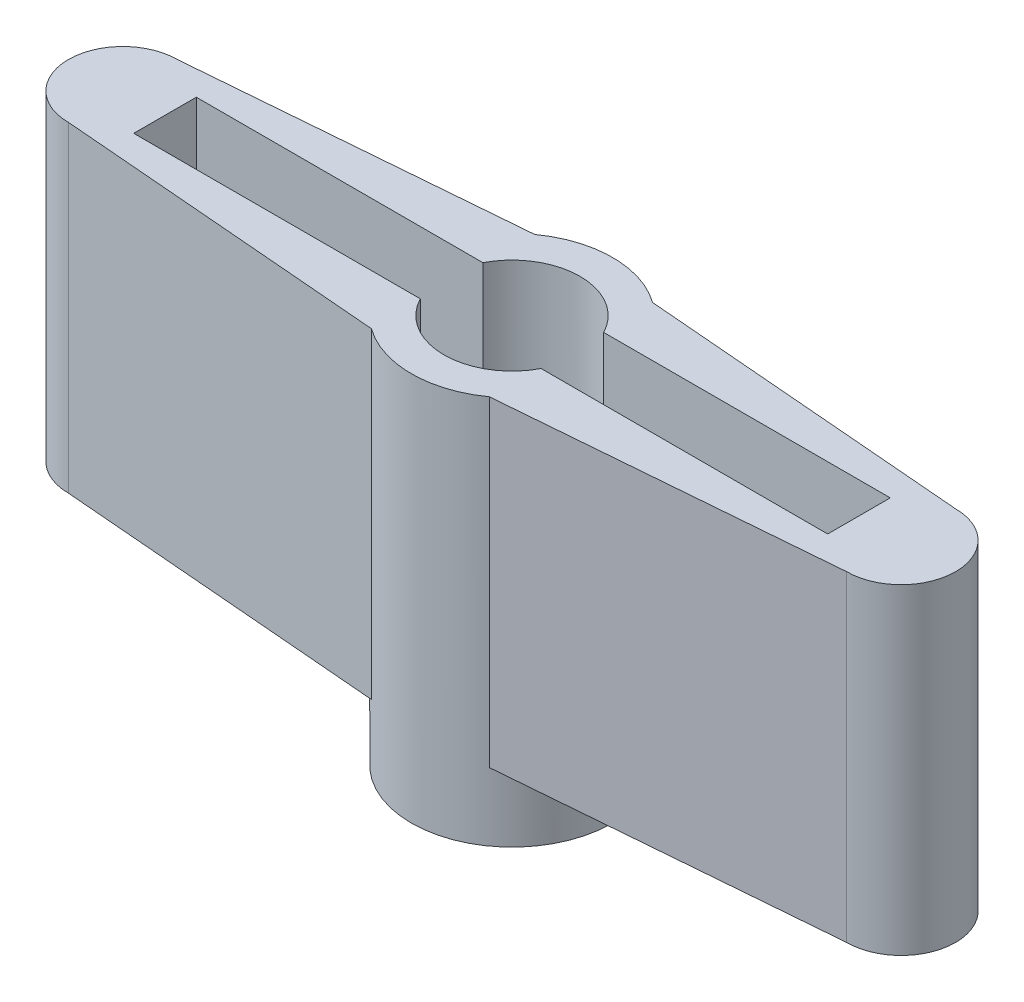
ISO-10303-21;
HEADER;
FILE_DESCRIPTION(('STEP AP214'),'2;1');
FILE_NAME('part.step','',(''),(''),'','','');
FILE_SCHEMA(('AUTOMOTIVE_DESIGN { 1 0 10303 214 1 1 1 1 }'));
ENDSEC;
DATA;
#1=APPLICATION_CONTEXT('core data for automotive mechanical design processes');
#2=APPLICATION_PROTOCOL_DEFINITION('international standard','automotive_design',2000,#1);
#3=PRODUCT_CONTEXT('',#1,'mechanical');
#4=PRODUCT('Part','Part','',(#3));
#5=PRODUCT_RELATED_PRODUCT_CATEGORY('part','',(#4));
#6=PRODUCT_DEFINITION_FORMATION('','',#4);
#7=PRODUCT_DEFINITION_CONTEXT('part definition',#1,'design');
#8=PRODUCT_DEFINITION('design','',#6,#7);
#9=PRODUCT_DEFINITION_SHAPE('','',#8);
#10=(LENGTH_UNIT() NAMED_UNIT(*) SI_UNIT(.MILLI.,.METRE.));
#11=(NAMED_UNIT(*) PLANE_ANGLE_UNIT() SI_UNIT($,.RADIAN.));
#12=(NAMED_UNIT(*) SI_UNIT($,.STERADIAN.) SOLID_ANGLE_UNIT());
#13=UNCERTAINTY_MEASURE_WITH_UNIT(LENGTH_MEASURE(1.E-05),#10,'distance_accuracy_value','');
#14=(GEOMETRIC_REPRESENTATION_CONTEXT(3) GLOBAL_UNCERTAINTY_ASSIGNED_CONTEXT((#13)) GLOBAL_UNIT_ASSIGNED_CONTEXT((#10,
#11,#12)) REPRESENTATION_CONTEXT('',''));
#15=CARTESIAN_POINT('',(0.,0.,0.));
#16=DIRECTION('',(0.,0.,1.));
#17=DIRECTION('',(1.,0.,0.));
#18=AXIS2_PLACEMENT_3D('',#15,#16,#17);
#19=CARTESIAN_POINT('',(0.,4.3,0.));
#20=DIRECTION('',(0.,-1.,0.));
#21=DIRECTION('',(0.,0.,-1.));
#22=AXIS2_PLACEMENT_3D('',#19,#20,#21);
#23=CYLINDRICAL_SURFACE('',#22,3.7);
#24=DIRECTION('',(0.,1.,0.));
#25=VECTOR('',#24,1.);
#26=CARTESIAN_POINT('',(-2.16564,2.5,-3.00000056506661));
#27=LINE('',#26,#25);
#28=CARTESIAN_POINT('',(-2.16564,2.5,-3.00000056506661));
#29=VERTEX_POINT('',#28);
#30=CARTESIAN_POINT('',(-2.16564,14.3,-3.00000056506661));
#31=VERTEX_POINT('',#30);
#32=EDGE_CURVE('E324',#29,#31,#27,.T.);
#33=ORIENTED_EDGE('',*,*,#32,.T.);
#34=CARTESIAN_POINT('',(0.,14.3,0.));
#35=DIRECTION('',(0.,1.,0.));
#36=DIRECTION('',(0.,0.,1.));
#37=AXIS2_PLACEMENT_3D('',#34,#35,#36);
#38=CIRCLE('',#37,3.7);
#39=CARTESIAN_POINT('',(2.16564,14.3,-3.00000056506661));
#40=VERTEX_POINT('',#39);
#41=EDGE_CURVE('E213',#40,#31,#38,.T.);
#42=ORIENTED_EDGE('',*,*,#41,.F.);
#43=DIRECTION('',(0.,1.,0.));
#44=VECTOR('',#43,1.);
#45=CARTESIAN_POINT('',(2.16564,2.5,-3.00000056506661));
#46=LINE('',#45,#44);
#47=CARTESIAN_POINT('',(2.16564,2.5,-3.00000056506661));
#48=VERTEX_POINT('',#47);
#49=EDGE_CURVE('E307',#48,#40,#46,.T.);
#50=ORIENTED_EDGE('',*,*,#49,.F.);
#51=CARTESIAN_POINT('',(0.,2.5,0.));
#52=DIRECTION('',(0.,-1.,0.));
#53=DIRECTION('',(0.,0.,-1.));
#54=AXIS2_PLACEMENT_3D('',#51,#52,#53);
#55=CIRCLE('',#54,3.7);
#56=CARTESIAN_POINT('',(2.16564,2.5,3.00000056506661));
#57=VERTEX_POINT('',#56);
#58=EDGE_CURVE('E351',#48,#57,#55,.T.);
#59=ORIENTED_EDGE('',*,*,#58,.T.);
#60=DIRECTION('',(0.,1.,0.));
#61=VECTOR('',#60,1.);
#62=CARTESIAN_POINT('',(2.16564,2.5,3.00000056506661));
#63=LINE('',#62,#61);
#64=CARTESIAN_POINT('',(2.16564,14.3,3.00000056506661));
#65=VERTEX_POINT('',#64);
#66=EDGE_CURVE('E306',#57,#65,#63,.T.);
#67=ORIENTED_EDGE('',*,*,#66,.T.);
#68=CARTESIAN_POINT('',(0.,14.3,0.));
#69=DIRECTION('',(0.,1.,0.));
#70=DIRECTION('',(0.,0.,1.));
#71=AXIS2_PLACEMENT_3D('',#68,#69,#70);
#72=CIRCLE('',#71,3.7);
#73=CARTESIAN_POINT('',(-2.16564,14.3,3.00000056506661));
#74=VERTEX_POINT('',#73);
#75=EDGE_CURVE('E201',#74,#65,#72,.T.);
#76=ORIENTED_EDGE('',*,*,#75,.F.);
#77=DIRECTION('',(0.,1.,0.));
#78=VECTOR('',#77,1.);
#79=CARTESIAN_POINT('',(-2.16564,2.5,3.00000056506661));
#80=LINE('',#79,#78);
#81=CARTESIAN_POINT('',(-2.16564,2.5,3.00000056506661));
#82=VERTEX_POINT('',#81);
#83=EDGE_CURVE('E327',#82,#74,#80,.T.);
#84=ORIENTED_EDGE('',*,*,#83,.F.);
#85=CARTESIAN_POINT('',(0.,2.5,0.));
#86=DIRECTION('',(0.,1.,0.));
#87=DIRECTION('',(0.,0.,1.));
#88=AXIS2_PLACEMENT_3D('',#85,#86,#87);
#89=CIRCLE('',#88,3.7);
#90=EDGE_CURVE('E349',#29,#82,#89,.T.);
#91=ORIENTED_EDGE('',*,*,#90,.F.);
#92=EDGE_LOOP('',(#33,#42,#50,#59,#67,#76,#84,#91));
#93=FACE_BOUND('',#92,.T.);
#94=CARTESIAN_POINT('',(0.,0.,0.));
#95=DIRECTION('',(0.,1.,0.));
#96=DIRECTION('',(0.,0.,1.));
#97=AXIS2_PLACEMENT_3D('',#94,#95,#96);
#98=CIRCLE('',#97,3.7);
#99=CARTESIAN_POINT('',(0.,0.,3.7));
#100=VERTEX_POINT('',#99);
#101=EDGE_CURVE('E344',#100,#100,#98,.T.);
#102=ORIENTED_EDGE('',*,*,#101,.T.);
#103=EDGE_LOOP('',(#102));
#104=FACE_BOUND('',#103,.T.);
#105=ADVANCED_FACE('F33',(#93,#104),#23,.T.);
#106=CARTESIAN_POINT('',(0.,0.,0.));
#107=DIRECTION('',(0.,1.,0.));
#108=DIRECTION('',(0.,0.,1.));
#109=AXIS2_PLACEMENT_3D('',#106,#107,#108);
#110=PLANE('',#109);
#111=CARTESIAN_POINT('',(0.,0.,0.));
#112=DIRECTION('',(0.,-1.,0.));
#113=DIRECTION('',(0.,0.,-1.));
#114=AXIS2_PLACEMENT_3D('',#111,#112,#113);
#115=CIRCLE('',#114,2.5);
#116=CARTESIAN_POINT('',(0.,0.,-2.5));
#117=VERTEX_POINT('',#116);
#118=EDGE_CURVE('E340',#117,#117,#115,.T.);
#119=ORIENTED_EDGE('',*,*,#118,.F.);
#120=EDGE_LOOP('',(#119));
#121=FACE_BOUND('',#120,.T.);
#122=ORIENTED_EDGE('',*,*,#101,.F.);
#123=EDGE_LOOP('',(#122));
#124=FACE_BOUND('',#123,.T.);
#125=ADVANCED_FACE('F390',(#121,#124),#110,.F.);
#126=CARTESIAN_POINT('',(0.,1.5,0.));
#127=DIRECTION('',(0.,-1.,0.));
#128=DIRECTION('',(0.,0.,-1.));
#129=AXIS2_PLACEMENT_3D('',#126,#127,#128);
#130=CYLINDRICAL_SURFACE('',#129,2.5);
#131=CARTESIAN_POINT('',(0.,1.5,0.));
#132=DIRECTION('',(0.,-1.,0.));
#133=DIRECTION('',(0.,0.,-1.));
#134=AXIS2_PLACEMENT_3D('',#131,#132,#133);
#135=CIRCLE('',#134,2.5);
#136=CARTESIAN_POINT('',(0.,1.5,-2.5));
#137=VERTEX_POINT('',#136);
#138=EDGE_CURVE('E341',#137,#137,#135,.T.);
#139=ORIENTED_EDGE('',*,*,#138,.F.);
#140=EDGE_LOOP('',(#139));
#141=FACE_BOUND('',#140,.T.);
#142=ORIENTED_EDGE('',*,*,#118,.T.);
#143=EDGE_LOOP('',(#142));
#144=FACE_BOUND('',#143,.T.);
#145=ADVANCED_FACE('F395',(#141,#144),#130,.F.);
#146=CARTESIAN_POINT('',(0.,1.5,0.));
#147=DIRECTION('',(0.,-1.,0.));
#148=DIRECTION('',(0.,0.,-1.));
#149=AXIS2_PLACEMENT_3D('',#146,#147,#148);
#150=PLANE('',#149);
#151=CARTESIAN_POINT('',(0.,1.5,0.));
#152=DIRECTION('',(0.,1.,0.));
#153=DIRECTION('',(0.,0.,1.));
#154=AXIS2_PLACEMENT_3D('',#151,#152,#153);
#155=CIRCLE('',#154,1.);
#156=CARTESIAN_POINT('',(0.,1.5,1.));
#157=VERTEX_POINT('',#156);
#158=EDGE_CURVE('E332',#157,#157,#155,.T.);
#159=ORIENTED_EDGE('',*,*,#158,.T.);
#160=EDGE_LOOP('',(#159));
#161=FACE_BOUND('',#160,.T.);
#162=ORIENTED_EDGE('',*,*,#138,.T.);
#163=EDGE_LOOP('',(#162));
#164=FACE_BOUND('',#163,.T.);
#165=ADVANCED_FACE('F464',(#161,#164),#150,.T.);
#166=CARTESIAN_POINT('',(0.,3.3,0.));
#167=DIRECTION('',(0.,1.,0.));
#168=DIRECTION('',(0.,0.,1.));
#169=AXIS2_PLACEMENT_3D('',#166,#167,#168);
#170=CYLINDRICAL_SURFACE('',#169,2.5);
#171=CARTESIAN_POINT('',(0.,7.3,0.));
#172=DIRECTION('',(0.,-1.,0.));
#173=DIRECTION('',(0.,0.,-1.));
#174=AXIS2_PLACEMENT_3D('',#171,#172,#173);
#175=CIRCLE('',#174,2.5);
#176=CARTESIAN_POINT('',(-2.21979728804231,7.3,-1.15));
#177=VERTEX_POINT('',#176);
#178=CARTESIAN_POINT('',(-2.21979728804231,7.3,1.15));
#179=VERTEX_POINT('',#178);
#180=EDGE_CURVE('E11',#177,#179,#175,.F.);
#181=ORIENTED_EDGE('',*,*,#180,.T.);
#182=DIRECTION('',(0.,1.,0.));
#183=VECTOR('',#182,1.);
#184=CARTESIAN_POINT('',(-2.21979728804231,3.3,1.15));
#185=LINE('',#184,#183);
#186=CARTESIAN_POINT('',(-2.21979728804231,14.3,1.15));
#187=VERTEX_POINT('',#186);
#188=EDGE_CURVE('E191',#179,#187,#185,.T.);
#189=ORIENTED_EDGE('',*,*,#188,.T.);
#190=CARTESIAN_POINT('',(0.,14.3,0.));
#191=DIRECTION('',(0.,1.,0.));
#192=DIRECTION('',(0.,0.,1.));
#193=AXIS2_PLACEMENT_3D('',#190,#191,#192);
#194=CIRCLE('',#193,2.5);
#195=CARTESIAN_POINT('',(2.21979728804231,14.3,1.15));
#196=VERTEX_POINT('',#195);
#197=EDGE_CURVE('E197',#187,#196,#194,.T.);
#198=ORIENTED_EDGE('',*,*,#197,.T.);
#199=DIRECTION('',(0.,1.,0.));
#200=VECTOR('',#199,1.);
#201=CARTESIAN_POINT('',(2.21979728804231,3.3,1.15));
#202=LINE('',#201,#200);
#203=CARTESIAN_POINT('',(2.21979728804231,7.3,1.15));
#204=VERTEX_POINT('',#203);
#205=EDGE_CURVE('E194',#196,#204,#202,.F.);
#206=ORIENTED_EDGE('',*,*,#205,.T.);
#207=CARTESIAN_POINT('',(2.21979728804231,7.3,-1.15));
#208=VERTEX_POINT('',#207);
#209=EDGE_CURVE('E36',#204,#208,#175,.F.);
#210=ORIENTED_EDGE('',*,*,#209,.T.);
#211=DIRECTION('',(0.,1.,0.));
#212=VECTOR('',#211,1.);
#213=CARTESIAN_POINT('',(2.21979728804231,3.3,-1.15));
#214=LINE('',#213,#212);
#215=CARTESIAN_POINT('',(2.21979728804231,14.3,-1.15));
#216=VERTEX_POINT('',#215);
#217=EDGE_CURVE('E159',#208,#216,#214,.T.);
#218=ORIENTED_EDGE('',*,*,#217,.T.);
#219=CARTESIAN_POINT('',(-2.21979728804231,14.3,-1.15));
#220=VERTEX_POINT('',#219);
#221=EDGE_CURVE('E200',#216,#220,#194,.T.);
#222=ORIENTED_EDGE('',*,*,#221,.T.);
#223=DIRECTION('',(0.,1.,0.));
#224=VECTOR('',#223,1.);
#225=CARTESIAN_POINT('',(-2.21979728804231,3.3,-1.15));
#226=LINE('',#225,#224);
#227=EDGE_CURVE('E55',#220,#177,#226,.F.);
#228=ORIENTED_EDGE('',*,*,#227,.T.);
#229=EDGE_LOOP('',(#181,#189,#198,#206,#210,#218,#222,#228));
#230=FACE_BOUND('',#229,.T.);
#231=CARTESIAN_POINT('',(0.,3.3,0.));
#232=DIRECTION('',(0.,1.,0.));
#233=DIRECTION('',(0.,0.,1.));
#234=AXIS2_PLACEMENT_3D('',#231,#232,#233);
#235=CIRCLE('',#234,2.5);
#236=CARTESIAN_POINT('',(0.,3.3,2.5));
#237=VERTEX_POINT('',#236);
#238=EDGE_CURVE('E335',#237,#237,#235,.T.);
#239=ORIENTED_EDGE('',*,*,#238,.F.);
#240=EDGE_LOOP('',(#239));
#241=FACE_BOUND('',#240,.T.);
#242=ADVANCED_FACE('F359',(#230,#241),#170,.F.);
#243=CARTESIAN_POINT('',(0.,3.3,0.));
#244=DIRECTION('',(0.,1.,0.));
#245=DIRECTION('',(0.,0.,1.));
#246=AXIS2_PLACEMENT_3D('',#243,#244,#245);
#247=PLANE('',#246);
#248=CARTESIAN_POINT('',(0.,3.3,0.));
#249=DIRECTION('',(0.,1.,0.));
#250=DIRECTION('',(0.,0.,1.));
#251=AXIS2_PLACEMENT_3D('',#248,#249,#250);
#252=CIRCLE('',#251,1.);
#253=CARTESIAN_POINT('',(0.,3.3,1.));
#254=VERTEX_POINT('',#253);
#255=EDGE_CURVE('E326',#254,#254,#252,.T.);
#256=ORIENTED_EDGE('',*,*,#255,.F.);
#257=EDGE_LOOP('',(#256));
#258=FACE_BOUND('',#257,.T.);
#259=ORIENTED_EDGE('',*,*,#238,.T.);
#260=EDGE_LOOP('',(#259));
#261=FACE_BOUND('',#260,.T.);
#262=ADVANCED_FACE('F457',(#258,#261),#247,.T.);
#263=CARTESIAN_POINT('',(0.,1.5,0.));
#264=DIRECTION('',(0.,1.,0.));
#265=DIRECTION('',(0.,0.,1.));
#266=AXIS2_PLACEMENT_3D('',#263,#264,#265);
#267=CYLINDRICAL_SURFACE('',#266,1.);
#268=ORIENTED_EDGE('',*,*,#158,.F.);
#269=EDGE_LOOP('',(#268));
#270=FACE_BOUND('',#269,.T.);
#271=ORIENTED_EDGE('',*,*,#255,.T.);
#272=EDGE_LOOP('',(#271));
#273=FACE_BOUND('',#272,.T.);
#274=ADVANCED_FACE('F454',(#270,#273),#267,.F.);
#275=CARTESIAN_POINT('',(-2.16564,2.5,-3.00000056506661));
#276=DIRECTION('',(-0.0821322265459028,0.,-0.996621441352037));
#277=DIRECTION('',(-0.996621441352037,0.,0.0821322265459028));
#278=AXIS2_PLACEMENT_3D('',#275,#276,#277);
#279=PLANE('',#278);
#280=DIRECTION('',(0.,1.,0.));
#281=VECTOR('',#280,1.);
#282=CARTESIAN_POINT('',(-14.3,2.5,-2.));
#283=LINE('',#282,#281);
#284=CARTESIAN_POINT('',(-14.3,2.5,-2.));
#285=VERTEX_POINT('',#284);
#286=CARTESIAN_POINT('',(-14.3,14.3,-2.));
#287=VERTEX_POINT('',#286);
#288=EDGE_CURVE('E323',#285,#287,#283,.T.);
#289=ORIENTED_EDGE('',*,*,#288,.T.);
#290=DIRECTION('',(-0.996621441352037,0.,0.0821322265459028));
#291=VECTOR('',#290,1.);
#292=CARTESIAN_POINT('',(-2.16564,14.3,-3.00000056506661));
#293=LINE('',#292,#291);
#294=EDGE_CURVE('E216',#31,#287,#293,.T.);
#295=ORIENTED_EDGE('',*,*,#294,.F.);
#296=ORIENTED_EDGE('',*,*,#32,.F.);
#297=DIRECTION('',(-0.996621441352037,0.,0.0821322265459028));
#298=VECTOR('',#297,1.);
#299=CARTESIAN_POINT('',(-2.16564,2.5,-3.00000056506661));
#300=LINE('',#299,#298);
#301=EDGE_CURVE('E309',#29,#285,#300,.T.);
#302=ORIENTED_EDGE('',*,*,#301,.T.);
#303=EDGE_LOOP('',(#289,#295,#296,#302));
#304=FACE_BOUND('',#303,.T.);
#305=ADVANCED_FACE('F409',(#304),#279,.T.);
#306=CARTESIAN_POINT('',(-2.16564,2.5,3.00000056506661));
#307=DIRECTION('',(-0.0821322265459026,0.,0.996621441352037));
#308=DIRECTION('',(0.996621441352037,0.,0.0821322265459026));
#309=AXIS2_PLACEMENT_3D('',#306,#307,#308);
#310=PLANE('',#309);
#311=ORIENTED_EDGE('',*,*,#83,.T.);
#312=DIRECTION('',(0.996621441352037,0.,0.0821322265459025));
#313=VECTOR('',#312,1.);
#314=CARTESIAN_POINT('',(-14.3,14.3,2.));
#315=LINE('',#314,#313);
#316=CARTESIAN_POINT('',(-14.3,14.3,2.));
#317=VERTEX_POINT('',#316);
#318=EDGE_CURVE('E222',#317,#74,#315,.T.);
#319=ORIENTED_EDGE('',*,*,#318,.F.);
#320=DIRECTION('',(0.,1.,0.));
#321=VECTOR('',#320,1.);
#322=CARTESIAN_POINT('',(-14.3,2.5,2.));
#323=LINE('',#322,#321);
#324=CARTESIAN_POINT('',(-14.3,2.5,2.));
#325=VERTEX_POINT('',#324);
#326=EDGE_CURVE('E329',#325,#317,#323,.T.);
#327=ORIENTED_EDGE('',*,*,#326,.F.);
#328=DIRECTION('',(0.996621441352037,0.,0.0821322265459026));
#329=VECTOR('',#328,1.);
#330=CARTESIAN_POINT('',(-2.16564,2.5,3.00000056506661));
#331=LINE('',#330,#329);
#332=EDGE_CURVE('E320',#325,#82,#331,.T.);
#333=ORIENTED_EDGE('',*,*,#332,.T.);
#334=EDGE_LOOP('',(#311,#319,#327,#333));
#335=FACE_BOUND('',#334,.T.);
#336=ADVANCED_FACE('F417',(#335),#310,.T.);
#337=CARTESIAN_POINT('',(-14.3,2.5,0.));
#338=DIRECTION('',(0.,1.,0.));
#339=DIRECTION('',(0.,0.,1.));
#340=AXIS2_PLACEMENT_3D('',#337,#338,#339);
#341=CYLINDRICAL_SURFACE('',#340,2.);
#342=ORIENTED_EDGE('',*,*,#326,.T.);
#343=CARTESIAN_POINT('',(-14.3,14.3,0.));
#344=DIRECTION('',(0.,1.,0.));
#345=DIRECTION('',(0.,0.,1.));
#346=AXIS2_PLACEMENT_3D('',#343,#344,#345);
#347=CIRCLE('',#346,2.);
#348=EDGE_CURVE('E219',#287,#317,#347,.T.);
#349=ORIENTED_EDGE('',*,*,#348,.F.);
#350=ORIENTED_EDGE('',*,*,#288,.F.);
#351=CARTESIAN_POINT('',(-14.3,2.5,0.));
#352=DIRECTION('',(0.,1.,0.));
#353=DIRECTION('',(0.,0.,1.));
#354=AXIS2_PLACEMENT_3D('',#351,#352,#353);
#355=CIRCLE('',#354,2.);
#356=EDGE_CURVE('E317',#285,#325,#355,.T.);
#357=ORIENTED_EDGE('',*,*,#356,.T.);
#358=EDGE_LOOP('',(#342,#349,#350,#357));
#359=FACE_BOUND('',#358,.T.);
#360=ADVANCED_FACE('F412',(#359),#341,.T.);
#361=CARTESIAN_POINT('',(-14.3,2.5,0.));
#362=DIRECTION('',(0.,1.,0.));
#363=DIRECTION('',(0.,0.,1.));
#364=AXIS2_PLACEMENT_3D('',#361,#362,#363);
#365=PLANE('',#364);
#366=CARTESIAN_POINT('',(-12.705,2.5,0.));
#367=DIRECTION('',(0.,1.,0.));
#368=DIRECTION('',(0.,0.,1.));
#369=AXIS2_PLACEMENT_3D('',#366,#367,#368);
#370=CIRCLE('',#369,0.595);
#371=CARTESIAN_POINT('',(-12.705,2.5,0.595000000000002));
#372=VERTEX_POINT('',#371);
#373=EDGE_CURVE('E226',#372,#372,#370,.T.);
#374=ORIENTED_EDGE('',*,*,#373,.T.);
#375=EDGE_LOOP('',(#374));
#376=FACE_BOUND('',#375,.T.);
#377=CARTESIAN_POINT('',(-10.705,2.5,0.));
#378=DIRECTION('',(0.,1.,0.));
#379=DIRECTION('',(0.,0.,1.));
#380=AXIS2_PLACEMENT_3D('',#377,#378,#379);
#381=CIRCLE('',#380,0.595);
#382=CARTESIAN_POINT('',(-10.705,2.5,0.595000000000002));
#383=VERTEX_POINT('',#382);
#384=EDGE_CURVE('E230',#383,#383,#381,.T.);
#385=ORIENTED_EDGE('',*,*,#384,.T.);
#386=EDGE_LOOP('',(#385));
#387=FACE_BOUND('',#386,.T.);
#388=CARTESIAN_POINT('',(-8.705,2.5,0.));
#389=DIRECTION('',(0.,1.,0.));
#390=DIRECTION('',(0.,0.,1.));
#391=AXIS2_PLACEMENT_3D('',#388,#389,#390);
#392=CIRCLE('',#391,0.595);
#393=CARTESIAN_POINT('',(-8.705,2.5,0.595000000000002));
#394=VERTEX_POINT('',#393);
#395=EDGE_CURVE('E238',#394,#394,#392,.T.);
#396=ORIENTED_EDGE('',*,*,#395,.T.);
#397=EDGE_LOOP('',(#396));
#398=FACE_BOUND('',#397,.T.);
#399=CARTESIAN_POINT('',(-6.705,2.5,0.));
#400=DIRECTION('',(0.,1.,0.));
#401=DIRECTION('',(0.,0.,1.));
#402=AXIS2_PLACEMENT_3D('',#399,#400,#401);
#403=CIRCLE('',#402,0.595);
#404=CARTESIAN_POINT('',(-6.705,2.5,0.595000000000002));
#405=VERTEX_POINT('',#404);
#406=EDGE_CURVE('E244',#405,#405,#403,.T.);
#407=ORIENTED_EDGE('',*,*,#406,.T.);
#408=EDGE_LOOP('',(#407));
#409=FACE_BOUND('',#408,.T.);
#410=CARTESIAN_POINT('',(-4.705,2.5,0.));
#411=DIRECTION('',(0.,1.,0.));
#412=DIRECTION('',(0.,0.,1.));
#413=AXIS2_PLACEMENT_3D('',#410,#411,#412);
#414=CIRCLE('',#413,0.595);
#415=CARTESIAN_POINT('',(-4.705,2.5,0.595000000000002));
#416=VERTEX_POINT('',#415);
#417=EDGE_CURVE('E250',#416,#416,#414,.T.);
#418=ORIENTED_EDGE('',*,*,#417,.T.);
#419=EDGE_LOOP('',(#418));
#420=FACE_BOUND('',#419,.T.);
#421=CARTESIAN_POINT('',(-14.705,2.5,0.));
#422=DIRECTION('',(0.,1.,0.));
#423=DIRECTION('',(0.,0.,1.));
#424=AXIS2_PLACEMENT_3D('',#421,#422,#423);
#425=CIRCLE('',#424,0.595);
#426=CARTESIAN_POINT('',(-14.705,2.5,0.595000000000002));
#427=VERTEX_POINT('',#426);
#428=EDGE_CURVE('E229',#427,#427,#425,.T.);
#429=ORIENTED_EDGE('',*,*,#428,.T.);
#430=EDGE_LOOP('',(#429));
#431=FACE_BOUND('',#430,.T.);
#432=ORIENTED_EDGE('',*,*,#301,.F.);
#433=ORIENTED_EDGE('',*,*,#90,.T.);
#434=ORIENTED_EDGE('',*,*,#332,.F.);
#435=ORIENTED_EDGE('',*,*,#356,.F.);
#436=EDGE_LOOP('',(#432,#433,#434,#435));
#437=FACE_BOUND('',#436,.T.);
#438=ADVANCED_FACE('F415',(#376,#387,#398,#409,#420,#431,#437),#365,.F.);
#439=CARTESIAN_POINT('',(2.16564,2.5,-3.00000056506661));
#440=DIRECTION('',(0.0821322265459028,0.,-0.996621441352037));
#441=DIRECTION('',(-0.996621441352037,0.,-0.0821322265459028));
#442=AXIS2_PLACEMENT_3D('',#439,#440,#441);
#443=PLANE('',#442);
#444=ORIENTED_EDGE('',*,*,#49,.T.);
#445=DIRECTION('',(-0.996621441352037,0.,-0.0821322265459028));
#446=VECTOR('',#445,1.);
#447=CARTESIAN_POINT('',(14.3,14.3,-2.));
#448=LINE('',#447,#446);
#449=CARTESIAN_POINT('',(14.3,14.3,-2.));
#450=VERTEX_POINT('',#449);
#451=EDGE_CURVE('E210',#450,#40,#448,.T.);
#452=ORIENTED_EDGE('',*,*,#451,.F.);
#453=DIRECTION('',(0.,1.,0.));
#454=VECTOR('',#453,1.);
#455=CARTESIAN_POINT('',(14.3,2.5,-2.));
#456=LINE('',#455,#454);
#457=CARTESIAN_POINT('',(14.3,2.5,-2.));
#458=VERTEX_POINT('',#457);
#459=EDGE_CURVE('E310',#458,#450,#456,.T.);
#460=ORIENTED_EDGE('',*,*,#459,.F.);
#461=DIRECTION('',(-0.996621441352037,0.,-0.0821322265459028));
#462=VECTOR('',#461,1.);
#463=CARTESIAN_POINT('',(2.16564,2.5,-3.00000056506661));
#464=LINE('',#463,#462);
#465=EDGE_CURVE('E303',#458,#48,#464,.T.);
#466=ORIENTED_EDGE('',*,*,#465,.T.);
#467=EDGE_LOOP('',(#444,#452,#460,#466));
#468=FACE_BOUND('',#467,.T.);
#469=ADVANCED_FACE('F428',(#468),#443,.T.);
#470=CARTESIAN_POINT('',(14.3,2.5,0.));
#471=DIRECTION('',(0.,1.,0.));
#472=DIRECTION('',(0.,0.,1.));
#473=AXIS2_PLACEMENT_3D('',#470,#471,#472);
#474=CYLINDRICAL_SURFACE('',#473,2.);
#475=ORIENTED_EDGE('',*,*,#459,.T.);
#476=CARTESIAN_POINT('',(14.3,14.3,0.));
#477=DIRECTION('',(0.,1.,0.));
#478=DIRECTION('',(0.,0.,1.));
#479=AXIS2_PLACEMENT_3D('',#476,#477,#478);
#480=CIRCLE('',#479,2.);
#481=CARTESIAN_POINT('',(14.3,14.3,2.));
#482=VERTEX_POINT('',#481);
#483=EDGE_CURVE('E207',#482,#450,#480,.T.);
#484=ORIENTED_EDGE('',*,*,#483,.F.);
#485=DIRECTION('',(0.,1.,0.));
#486=VECTOR('',#485,1.);
#487=CARTESIAN_POINT('',(14.3,2.5,2.));
#488=LINE('',#487,#486);
#489=CARTESIAN_POINT('',(14.3,2.5,2.));
#490=VERTEX_POINT('',#489);
#491=EDGE_CURVE('E312',#490,#482,#488,.T.);
#492=ORIENTED_EDGE('',*,*,#491,.F.);
#493=CARTESIAN_POINT('',(14.3,2.5,0.));
#494=DIRECTION('',(0.,1.,0.));
#495=DIRECTION('',(0.,0.,-1.));
#496=AXIS2_PLACEMENT_3D('',#493,#494,#495);
#497=CIRCLE('',#496,2.);
#498=EDGE_CURVE('E300',#490,#458,#497,.T.);
#499=ORIENTED_EDGE('',*,*,#498,.T.);
#500=EDGE_LOOP('',(#475,#484,#492,#499));
#501=FACE_BOUND('',#500,.T.);
#502=ADVANCED_FACE('F424',(#501),#474,.T.);
#503=CARTESIAN_POINT('',(2.16564,2.5,3.00000056506661));
#504=DIRECTION('',(0.0821322265459026,0.,0.996621441352037));
#505=DIRECTION('',(0.996621441352037,0.,-0.0821322265459026));
#506=AXIS2_PLACEMENT_3D('',#503,#504,#505);
#507=PLANE('',#506);
#508=ORIENTED_EDGE('',*,*,#491,.T.);
#509=DIRECTION('',(0.996621441352037,0.,-0.0821322265459026));
#510=VECTOR('',#509,1.);
#511=CARTESIAN_POINT('',(2.16564,14.3,3.00000056506661));
#512=LINE('',#511,#510);
#513=EDGE_CURVE('E204',#65,#482,#512,.T.);
#514=ORIENTED_EDGE('',*,*,#513,.F.);
#515=ORIENTED_EDGE('',*,*,#66,.F.);
#516=DIRECTION('',(0.996621441352037,0.,-0.0821322265459026));
#517=VECTOR('',#516,1.);
#518=CARTESIAN_POINT('',(2.16564,2.5,3.00000056506661));
#519=LINE('',#518,#517);
#520=EDGE_CURVE('E295',#57,#490,#519,.T.);
#521=ORIENTED_EDGE('',*,*,#520,.T.);
#522=EDGE_LOOP('',(#508,#514,#515,#521));
#523=FACE_BOUND('',#522,.T.);
#524=ADVANCED_FACE('F432',(#523),#507,.T.);
#525=CARTESIAN_POINT('',(14.3,2.5,0.));
#526=DIRECTION('',(0.,-1.,0.));
#527=DIRECTION('',(0.,0.,-1.));
#528=AXIS2_PLACEMENT_3D('',#525,#526,#527);
#529=PLANE('',#528);
#530=CARTESIAN_POINT('',(14.705,2.5,0.));
#531=DIRECTION('',(0.,1.,0.));
#532=DIRECTION('',(0.,0.,-1.));
#533=AXIS2_PLACEMENT_3D('',#530,#531,#532);
#534=CIRCLE('',#533,0.595);
#535=CARTESIAN_POINT('',(14.705,2.5,-0.594999999999998));
#536=VERTEX_POINT('',#535);
#537=EDGE_CURVE('E256',#536,#536,#534,.T.);
#538=ORIENTED_EDGE('',*,*,#537,.T.);
#539=EDGE_LOOP('',(#538));
#540=FACE_BOUND('',#539,.T.);
#541=CARTESIAN_POINT('',(12.705,2.5,0.));
#542=DIRECTION('',(0.,1.,0.));
#543=DIRECTION('',(0.,0.,-1.));
#544=AXIS2_PLACEMENT_3D('',#541,#542,#543);
#545=CIRCLE('',#544,0.595);
#546=CARTESIAN_POINT('',(12.705,2.5,-0.594999999999998));
#547=VERTEX_POINT('',#546);
#548=EDGE_CURVE('E262',#547,#547,#545,.T.);
#549=ORIENTED_EDGE('',*,*,#548,.T.);
#550=EDGE_LOOP('',(#549));
#551=FACE_BOUND('',#550,.T.);
#552=CARTESIAN_POINT('',(10.705,2.5,0.));
#553=DIRECTION('',(0.,1.,0.));
#554=DIRECTION('',(0.,0.,-1.));
#555=AXIS2_PLACEMENT_3D('',#552,#553,#554);
#556=CIRCLE('',#555,0.595);
#557=CARTESIAN_POINT('',(10.705,2.5,-0.594999999999998));
#558=VERTEX_POINT('',#557);
#559=EDGE_CURVE('E268',#558,#558,#556,.T.);
#560=ORIENTED_EDGE('',*,*,#559,.T.);
#561=EDGE_LOOP('',(#560));
#562=FACE_BOUND('',#561,.T.);
#563=CARTESIAN_POINT('',(8.705,2.5,0.));
#564=DIRECTION('',(0.,1.,0.));
#565=DIRECTION('',(0.,0.,-1.));
#566=AXIS2_PLACEMENT_3D('',#563,#564,#565);
#567=CIRCLE('',#566,0.595);
#568=CARTESIAN_POINT('',(8.705,2.5,-0.594999999999998));
#569=VERTEX_POINT('',#568);
#570=EDGE_CURVE('E274',#569,#569,#567,.T.);
#571=ORIENTED_EDGE('',*,*,#570,.T.);
#572=EDGE_LOOP('',(#571));
#573=FACE_BOUND('',#572,.T.);
#574=CARTESIAN_POINT('',(6.705,2.5,0.));
#575=DIRECTION('',(0.,1.,0.));
#576=DIRECTION('',(0.,0.,-1.));
#577=AXIS2_PLACEMENT_3D('',#574,#575,#576);
#578=CIRCLE('',#577,0.595);
#579=CARTESIAN_POINT('',(6.705,2.5,-0.594999999999998));
#580=VERTEX_POINT('',#579);
#581=EDGE_CURVE('E280',#580,#580,#578,.T.);
#582=ORIENTED_EDGE('',*,*,#581,.T.);
#583=EDGE_LOOP('',(#582));
#584=FACE_BOUND('',#583,.T.);
#585=CARTESIAN_POINT('',(4.705,2.5,0.));
#586=DIRECTION('',(0.,1.,0.));
#587=DIRECTION('',(0.,0.,-1.));
#588=AXIS2_PLACEMENT_3D('',#585,#586,#587);
#589=CIRCLE('',#588,0.595);
#590=CARTESIAN_POINT('',(4.705,2.5,-0.594999999999998));
#591=VERTEX_POINT('',#590);
#592=EDGE_CURVE('E234',#591,#591,#589,.T.);
#593=ORIENTED_EDGE('',*,*,#592,.T.);
#594=EDGE_LOOP('',(#593));
#595=FACE_BOUND('',#594,.T.);
#596=ORIENTED_EDGE('',*,*,#58,.F.);
#597=ORIENTED_EDGE('',*,*,#465,.F.);
#598=ORIENTED_EDGE('',*,*,#498,.F.);
#599=ORIENTED_EDGE('',*,*,#520,.F.);
#600=EDGE_LOOP('',(#596,#597,#598,#599));
#601=FACE_BOUND('',#600,.T.);
#602=ADVANCED_FACE('F431',(#540,#551,#562,#573,#584,#595,#601),#529,.T.);
#603=CARTESIAN_POINT('',(-14.705,2.5,0.));
#604=DIRECTION('',(0.,1.,0.));
#605=DIRECTION('',(0.,0.,1.));
#606=AXIS2_PLACEMENT_3D('',#603,#604,#605);
#607=CYLINDRICAL_SURFACE('',#606,0.595);
#608=ORIENTED_EDGE('',*,*,#428,.F.);
#609=EDGE_LOOP('',(#608));
#610=FACE_BOUND('',#609,.T.);
#611=CARTESIAN_POINT('',(-14.705,4.3,0.));
#612=DIRECTION('',(0.,1.,0.));
#613=DIRECTION('',(0.,0.,1.));
#614=AXIS2_PLACEMENT_3D('',#611,#612,#613);
#615=CIRCLE('',#614,0.595);
#616=CARTESIAN_POINT('',(-14.705,4.3,0.595000000000002));
#617=VERTEX_POINT('',#616);
#618=EDGE_CURVE('E225',#617,#617,#615,.T.);
#619=ORIENTED_EDGE('',*,*,#618,.T.);
#620=EDGE_LOOP('',(#619));
#621=FACE_BOUND('',#620,.T.);
#622=ADVANCED_FACE('F439',(#610,#621),#607,.F.);
#623=CARTESIAN_POINT('',(4.705,2.5,0.));
#624=DIRECTION('',(0.,1.,0.));
#625=DIRECTION('',(0.,0.,1.));
#626=AXIS2_PLACEMENT_3D('',#623,#624,#625);
#627=CYLINDRICAL_SURFACE('',#626,0.595);
#628=ORIENTED_EDGE('',*,*,#592,.F.);
#629=EDGE_LOOP('',(#628));
#630=FACE_BOUND('',#629,.T.);
#631=CARTESIAN_POINT('',(4.705,4.3,0.));
#632=DIRECTION('',(0.,1.,0.));
#633=DIRECTION('',(0.,0.,-1.));
#634=AXIS2_PLACEMENT_3D('',#631,#632,#633);
#635=CIRCLE('',#634,0.595);
#636=CARTESIAN_POINT('',(4.705,4.3,-0.594999999999998));
#637=VERTEX_POINT('',#636);
#638=EDGE_CURVE('E288',#637,#637,#635,.T.);
#639=ORIENTED_EDGE('',*,*,#638,.T.);
#640=EDGE_LOOP('',(#639));
#641=FACE_BOUND('',#640,.T.);
#642=ADVANCED_FACE('F735',(#630,#641),#627,.F.);
#643=CARTESIAN_POINT('',(6.705,2.5,0.));
#644=DIRECTION('',(0.,1.,0.));
#645=DIRECTION('',(0.,0.,1.));
#646=AXIS2_PLACEMENT_3D('',#643,#644,#645);
#647=CYLINDRICAL_SURFACE('',#646,0.595);
#648=ORIENTED_EDGE('',*,*,#581,.F.);
#649=EDGE_LOOP('',(#648));
#650=FACE_BOUND('',#649,.T.);
#651=CARTESIAN_POINT('',(6.705,4.3,0.));
#652=DIRECTION('',(0.,1.,0.));
#653=DIRECTION('',(0.,0.,-1.));
#654=AXIS2_PLACEMENT_3D('',#651,#652,#653);
#655=CIRCLE('',#654,0.595);
#656=CARTESIAN_POINT('',(6.705,4.3,-0.594999999999998));
#657=VERTEX_POINT('',#656);
#658=EDGE_CURVE('E283',#657,#657,#655,.T.);
#659=ORIENTED_EDGE('',*,*,#658,.T.);
#660=EDGE_LOOP('',(#659));
#661=FACE_BOUND('',#660,.T.);
#662=ADVANCED_FACE('F731',(#650,#661),#647,.F.);
#663=CARTESIAN_POINT('',(8.705,2.5,0.));
#664=DIRECTION('',(0.,1.,0.));
#665=DIRECTION('',(0.,0.,1.));
#666=AXIS2_PLACEMENT_3D('',#663,#664,#665);
#667=CYLINDRICAL_SURFACE('',#666,0.595);
#668=ORIENTED_EDGE('',*,*,#570,.F.);
#669=EDGE_LOOP('',(#668));
#670=FACE_BOUND('',#669,.T.);
#671=CARTESIAN_POINT('',(8.705,4.3,0.));
#672=DIRECTION('',(0.,1.,0.));
#673=DIRECTION('',(0.,0.,-1.));
#674=AXIS2_PLACEMENT_3D('',#671,#672,#673);
#675=CIRCLE('',#674,0.595);
#676=CARTESIAN_POINT('',(8.705,4.3,-0.594999999999998));
#677=VERTEX_POINT('',#676);
#678=EDGE_CURVE('E277',#677,#677,#675,.T.);
#679=ORIENTED_EDGE('',*,*,#678,.T.);
#680=EDGE_LOOP('',(#679));
#681=FACE_BOUND('',#680,.T.);
#682=ADVANCED_FACE('F727',(#670,#681),#667,.F.);
#683=CARTESIAN_POINT('',(10.705,2.5,0.));
#684=DIRECTION('',(0.,1.,0.));
#685=DIRECTION('',(0.,0.,1.));
#686=AXIS2_PLACEMENT_3D('',#683,#684,#685);
#687=CYLINDRICAL_SURFACE('',#686,0.595);
#688=ORIENTED_EDGE('',*,*,#559,.F.);
#689=EDGE_LOOP('',(#688));
#690=FACE_BOUND('',#689,.T.);
#691=CARTESIAN_POINT('',(10.705,4.3,0.));
#692=DIRECTION('',(0.,1.,0.));
#693=DIRECTION('',(0.,0.,-1.));
#694=AXIS2_PLACEMENT_3D('',#691,#692,#693);
#695=CIRCLE('',#694,0.595);
#696=CARTESIAN_POINT('',(10.705,4.3,-0.594999999999998));
#697=VERTEX_POINT('',#696);
#698=EDGE_CURVE('E271',#697,#697,#695,.T.);
#699=ORIENTED_EDGE('',*,*,#698,.T.);
#700=EDGE_LOOP('',(#699));
#701=FACE_BOUND('',#700,.T.);
#702=ADVANCED_FACE('F723',(#690,#701),#687,.F.);
#703=CARTESIAN_POINT('',(12.705,2.5,0.));
#704=DIRECTION('',(0.,1.,0.));
#705=DIRECTION('',(0.,0.,1.));
#706=AXIS2_PLACEMENT_3D('',#703,#704,#705);
#707=CYLINDRICAL_SURFACE('',#706,0.595);
#708=ORIENTED_EDGE('',*,*,#548,.F.);
#709=EDGE_LOOP('',(#708));
#710=FACE_BOUND('',#709,.T.);
#711=CARTESIAN_POINT('',(12.705,4.3,0.));
#712=DIRECTION('',(0.,1.,0.));
#713=DIRECTION('',(0.,0.,-1.));
#714=AXIS2_PLACEMENT_3D('',#711,#712,#713);
#715=CIRCLE('',#714,0.595);
#716=CARTESIAN_POINT('',(12.705,4.3,-0.594999999999998));
#717=VERTEX_POINT('',#716);
#718=EDGE_CURVE('E265',#717,#717,#715,.T.);
#719=ORIENTED_EDGE('',*,*,#718,.T.);
#720=EDGE_LOOP('',(#719));
#721=FACE_BOUND('',#720,.T.);
#722=ADVANCED_FACE('F719',(#710,#721),#707,.F.);
#723=CARTESIAN_POINT('',(14.705,2.5,0.));
#724=DIRECTION('',(0.,1.,0.));
#725=DIRECTION('',(0.,0.,1.));
#726=AXIS2_PLACEMENT_3D('',#723,#724,#725);
#727=CYLINDRICAL_SURFACE('',#726,0.595);
#728=ORIENTED_EDGE('',*,*,#537,.F.);
#729=EDGE_LOOP('',(#728));
#730=FACE_BOUND('',#729,.T.);
#731=CARTESIAN_POINT('',(14.705,4.3,0.));
#732=DIRECTION('',(0.,1.,0.));
#733=DIRECTION('',(0.,0.,-1.));
#734=AXIS2_PLACEMENT_3D('',#731,#732,#733);
#735=CIRCLE('',#734,0.595);
#736=CARTESIAN_POINT('',(14.705,4.3,-0.594999999999998));
#737=VERTEX_POINT('',#736);
#738=EDGE_CURVE('E259',#737,#737,#735,.T.);
#739=ORIENTED_EDGE('',*,*,#738,.T.);
#740=EDGE_LOOP('',(#739));
#741=FACE_BOUND('',#740,.T.);
#742=ADVANCED_FACE('F715',(#730,#741),#727,.F.);
#743=CARTESIAN_POINT('',(-4.705,2.5,0.));
#744=DIRECTION('',(0.,1.,0.));
#745=DIRECTION('',(0.,0.,1.));
#746=AXIS2_PLACEMENT_3D('',#743,#744,#745);
#747=CYLINDRICAL_SURFACE('',#746,0.595);
#748=ORIENTED_EDGE('',*,*,#417,.F.);
#749=EDGE_LOOP('',(#748));
#750=FACE_BOUND('',#749,.T.);
#751=CARTESIAN_POINT('',(-4.705,4.3,0.));
#752=DIRECTION('',(0.,1.,0.));
#753=DIRECTION('',(0.,0.,1.));
#754=AXIS2_PLACEMENT_3D('',#751,#752,#753);
#755=CIRCLE('',#754,0.595);
#756=CARTESIAN_POINT('',(-4.705,4.3,0.595000000000002));
#757=VERTEX_POINT('',#756);
#758=EDGE_CURVE('E253',#757,#757,#755,.T.);
#759=ORIENTED_EDGE('',*,*,#758,.T.);
#760=EDGE_LOOP('',(#759));
#761=FACE_BOUND('',#760,.T.);
#762=ADVANCED_FACE('F711',(#750,#761),#747,.F.);
#763=CARTESIAN_POINT('',(-6.705,2.5,0.));
#764=DIRECTION('',(0.,1.,0.));
#765=DIRECTION('',(0.,0.,1.));
#766=AXIS2_PLACEMENT_3D('',#763,#764,#765);
#767=CYLINDRICAL_SURFACE('',#766,0.595);
#768=ORIENTED_EDGE('',*,*,#406,.F.);
#769=EDGE_LOOP('',(#768));
#770=FACE_BOUND('',#769,.T.);
#771=CARTESIAN_POINT('',(-6.705,4.3,0.));
#772=DIRECTION('',(0.,1.,0.));
#773=DIRECTION('',(0.,0.,1.));
#774=AXIS2_PLACEMENT_3D('',#771,#772,#773);
#775=CIRCLE('',#774,0.595);
#776=CARTESIAN_POINT('',(-6.705,4.3,0.595000000000002));
#777=VERTEX_POINT('',#776);
#778=EDGE_CURVE('E247',#777,#777,#775,.T.);
#779=ORIENTED_EDGE('',*,*,#778,.T.);
#780=EDGE_LOOP('',(#779));
#781=FACE_BOUND('',#780,.T.);
#782=ADVANCED_FACE('F707',(#770,#781),#767,.F.);
#783=CARTESIAN_POINT('',(-8.705,2.5,0.));
#784=DIRECTION('',(0.,1.,0.));
#785=DIRECTION('',(0.,0.,1.));
#786=AXIS2_PLACEMENT_3D('',#783,#784,#785);
#787=CYLINDRICAL_SURFACE('',#786,0.595);
#788=ORIENTED_EDGE('',*,*,#395,.F.);
#789=EDGE_LOOP('',(#788));
#790=FACE_BOUND('',#789,.T.);
#791=CARTESIAN_POINT('',(-8.705,4.3,0.));
#792=DIRECTION('',(0.,1.,0.));
#793=DIRECTION('',(0.,0.,1.));
#794=AXIS2_PLACEMENT_3D('',#791,#792,#793);
#795=CIRCLE('',#794,0.595);
#796=CARTESIAN_POINT('',(-8.705,4.3,0.595000000000002));
#797=VERTEX_POINT('',#796);
#798=EDGE_CURVE('E241',#797,#797,#795,.T.);
#799=ORIENTED_EDGE('',*,*,#798,.T.);
#800=EDGE_LOOP('',(#799));
#801=FACE_BOUND('',#800,.T.);
#802=ADVANCED_FACE('F703',(#790,#801),#787,.F.);
#803=CARTESIAN_POINT('',(-10.705,2.5,0.));
#804=DIRECTION('',(0.,1.,0.));
#805=DIRECTION('',(0.,0.,1.));
#806=AXIS2_PLACEMENT_3D('',#803,#804,#805);
#807=CYLINDRICAL_SURFACE('',#806,0.595);
#808=ORIENTED_EDGE('',*,*,#384,.F.);
#809=EDGE_LOOP('',(#808));
#810=FACE_BOUND('',#809,.T.);
#811=CARTESIAN_POINT('',(-10.705,4.3,0.));
#812=DIRECTION('',(0.,1.,0.));
#813=DIRECTION('',(0.,0.,1.));
#814=AXIS2_PLACEMENT_3D('',#811,#812,#813);
#815=CIRCLE('',#814,0.595);
#816=CARTESIAN_POINT('',(-10.705,4.3,0.595000000000002));
#817=VERTEX_POINT('',#816);
#818=EDGE_CURVE('E235',#817,#817,#815,.T.);
#819=ORIENTED_EDGE('',*,*,#818,.T.);
#820=EDGE_LOOP('',(#819));
#821=FACE_BOUND('',#820,.T.);
#822=ADVANCED_FACE('F699',(#810,#821),#807,.F.);
#823=CARTESIAN_POINT('',(-12.705,2.5,0.));
#824=DIRECTION('',(0.,1.,0.));
#825=DIRECTION('',(0.,0.,1.));
#826=AXIS2_PLACEMENT_3D('',#823,#824,#825);
#827=CYLINDRICAL_SURFACE('',#826,0.595);
#828=ORIENTED_EDGE('',*,*,#373,.F.);
#829=EDGE_LOOP('',(#828));
#830=FACE_BOUND('',#829,.T.);
#831=CARTESIAN_POINT('',(-12.705,4.3,0.));
#832=DIRECTION('',(0.,1.,0.));
#833=DIRECTION('',(0.,0.,1.));
#834=AXIS2_PLACEMENT_3D('',#831,#832,#833);
#835=CIRCLE('',#834,0.595);
#836=CARTESIAN_POINT('',(-12.705,4.3,0.595000000000002));
#837=VERTEX_POINT('',#836);
#838=EDGE_CURVE('E231',#837,#837,#835,.T.);
#839=ORIENTED_EDGE('',*,*,#838,.T.);
#840=EDGE_LOOP('',(#839));
#841=FACE_BOUND('',#840,.T.);
#842=ADVANCED_FACE('F539',(#830,#841),#827,.F.);
#843=CARTESIAN_POINT('',(0.,4.3,0.));
#844=DIRECTION('',(0.,1.,0.));
#845=DIRECTION('',(0.,0.,1.));
#846=AXIS2_PLACEMENT_3D('',#843,#844,#845);
#847=PLANE('',#846);
#848=ORIENTED_EDGE('',*,*,#618,.F.);
#849=EDGE_LOOP('',(#848));
#850=FACE_BOUND('',#849,.T.);
#851=ADVANCED_FACE('F534',(#850),#847,.F.);
#852=ORIENTED_EDGE('',*,*,#638,.F.);
#853=EDGE_LOOP('',(#852));
#854=FACE_BOUND('',#853,.T.);
#855=ADVANCED_FACE('F538',(#854),#847,.F.);
#856=ORIENTED_EDGE('',*,*,#658,.F.);
#857=EDGE_LOOP('',(#856));
#858=FACE_BOUND('',#857,.T.);
#859=ADVANCED_FACE('F551',(#858),#847,.F.);
#860=ORIENTED_EDGE('',*,*,#678,.F.);
#861=EDGE_LOOP('',(#860));
#862=FACE_BOUND('',#861,.T.);
#863=ADVANCED_FACE('F560',(#862),#847,.F.);
#864=ORIENTED_EDGE('',*,*,#698,.F.);
#865=EDGE_LOOP('',(#864));
#866=FACE_BOUND('',#865,.T.);
#867=ADVANCED_FACE('F569',(#866),#847,.F.);
#868=ORIENTED_EDGE('',*,*,#718,.F.);
#869=EDGE_LOOP('',(#868));
#870=FACE_BOUND('',#869,.T.);
#871=ADVANCED_FACE('F578',(#870),#847,.F.);
#872=ORIENTED_EDGE('',*,*,#738,.F.);
#873=EDGE_LOOP('',(#872));
#874=FACE_BOUND('',#873,.T.);
#875=ADVANCED_FACE('F587',(#874),#847,.F.);
#876=ORIENTED_EDGE('',*,*,#758,.F.);
#877=EDGE_LOOP('',(#876));
#878=FACE_BOUND('',#877,.T.);
#879=ADVANCED_FACE('F596',(#878),#847,.F.);
#880=ORIENTED_EDGE('',*,*,#778,.F.);
#881=EDGE_LOOP('',(#880));
#882=FACE_BOUND('',#881,.T.);
#883=ADVANCED_FACE('F605',(#882),#847,.F.);
#884=ORIENTED_EDGE('',*,*,#798,.F.);
#885=EDGE_LOOP('',(#884));
#886=FACE_BOUND('',#885,.T.);
#887=ADVANCED_FACE('F614',(#886),#847,.F.);
#888=ORIENTED_EDGE('',*,*,#818,.F.);
#889=EDGE_LOOP('',(#888));
#890=FACE_BOUND('',#889,.T.);
#891=ADVANCED_FACE('F623',(#890),#847,.F.);
#892=ORIENTED_EDGE('',*,*,#838,.F.);
#893=EDGE_LOOP('',(#892));
#894=FACE_BOUND('',#893,.T.);
#895=ADVANCED_FACE('F542',(#894),#847,.F.);
#896=CARTESIAN_POINT('',(0.,14.3,0.));
#897=DIRECTION('',(0.,1.,0.));
#898=DIRECTION('',(0.,0.,1.));
#899=AXIS2_PLACEMENT_3D('',#896,#897,#898);
#900=PLANE('',#899);
#901=DIRECTION('',(1.,0.,0.));
#902=VECTOR('',#901,1.);
#903=CARTESIAN_POINT('',(0.,14.3,1.15));
#904=LINE('',#903,#902);
#905=CARTESIAN_POINT('',(12.75,14.3,1.15));
#906=VERTEX_POINT('',#905);
#907=EDGE_CURVE('E355',#196,#906,#904,.T.);
#908=ORIENTED_EDGE('',*,*,#907,.F.);
#909=ORIENTED_EDGE('',*,*,#197,.F.);
#910=DIRECTION('',(1.,0.,0.));
#911=VECTOR('',#910,1.);
#912=CARTESIAN_POINT('',(-12.75,14.3,1.15));
#913=LINE('',#912,#911);
#914=CARTESIAN_POINT('',(-12.75,14.3,1.15));
#915=VERTEX_POINT('',#914);
#916=EDGE_CURVE('E169',#915,#187,#913,.T.);
#917=ORIENTED_EDGE('',*,*,#916,.F.);
#918=DIRECTION('',(0.,0.,1.));
#919=VECTOR('',#918,1.);
#920=CARTESIAN_POINT('',(-12.75,14.3,1.15));
#921=LINE('',#920,#919);
#922=CARTESIAN_POINT('',(-12.75,14.3,-1.15));
#923=VERTEX_POINT('',#922);
#924=EDGE_CURVE('E171',#923,#915,#921,.T.);
#925=ORIENTED_EDGE('',*,*,#924,.F.);
#926=DIRECTION('',(-1.,0.,0.));
#927=VECTOR('',#926,1.);
#928=CARTESIAN_POINT('',(0.,14.3,-1.15));
#929=LINE('',#928,#927);
#930=EDGE_CURVE('E354',#220,#923,#929,.T.);
#931=ORIENTED_EDGE('',*,*,#930,.F.);
#932=ORIENTED_EDGE('',*,*,#221,.F.);
#933=DIRECTION('',(-1.,0.,0.));
#934=VECTOR('',#933,1.);
#935=CARTESIAN_POINT('',(-12.75,14.3,-1.15));
#936=LINE('',#935,#934);
#937=CARTESIAN_POINT('',(12.75,14.3,-1.15));
#938=VERTEX_POINT('',#937);
#939=EDGE_CURVE('E179',#938,#216,#936,.T.);
#940=ORIENTED_EDGE('',*,*,#939,.F.);
#941=DIRECTION('',(0.,0.,-1.));
#942=VECTOR('',#941,1.);
#943=CARTESIAN_POINT('',(12.75,14.3,1.15));
#944=LINE('',#943,#942);
#945=EDGE_CURVE('E47',#906,#938,#944,.T.);
#946=ORIENTED_EDGE('',*,*,#945,.F.);
#947=EDGE_LOOP('',(#908,#909,#917,#925,#931,#932,#940,#946));
#948=FACE_BOUND('',#947,.T.);
#949=ORIENTED_EDGE('',*,*,#75,.T.);
#950=ORIENTED_EDGE('',*,*,#513,.T.);
#951=ORIENTED_EDGE('',*,*,#483,.T.);
#952=ORIENTED_EDGE('',*,*,#451,.T.);
#953=ORIENTED_EDGE('',*,*,#41,.T.);
#954=ORIENTED_EDGE('',*,*,#294,.T.);
#955=ORIENTED_EDGE('',*,*,#348,.T.);
#956=ORIENTED_EDGE('',*,*,#318,.T.);
#957=EDGE_LOOP('',(#949,#950,#951,#952,#953,#954,#955,#956));
#958=FACE_BOUND('',#957,.T.);
#959=ADVANCED_FACE('F365',(#948,#958),#900,.T.);
#960=CARTESIAN_POINT('',(-12.75,7.3,-1.15));
#961=DIRECTION('',(0.,0.,-1.));
#962=DIRECTION('',(-1.,0.,0.));
#963=AXIS2_PLACEMENT_3D('',#960,#961,#962);
#964=PLANE('',#963);
#965=ORIENTED_EDGE('',*,*,#930,.T.);
#966=DIRECTION('',(0.,1.,0.));
#967=VECTOR('',#966,1.);
#968=CARTESIAN_POINT('',(-12.75,7.3,-1.15));
#969=LINE('',#968,#967);
#970=CARTESIAN_POINT('',(-12.75,7.3,-1.15));
#971=VERTEX_POINT('',#970);
#972=EDGE_CURVE('E152',#971,#923,#969,.T.);
#973=ORIENTED_EDGE('',*,*,#972,.F.);
#974=DIRECTION('',(-1.,0.,0.));
#975=VECTOR('',#974,1.);
#976=CARTESIAN_POINT('',(-12.75,7.3,-1.15));
#977=LINE('',#976,#975);
#978=EDGE_CURVE('E163',#177,#971,#977,.T.);
#979=ORIENTED_EDGE('',*,*,#978,.F.);
#980=ORIENTED_EDGE('',*,*,#227,.F.);
#981=EDGE_LOOP('',(#965,#973,#979,#980));
#982=FACE_BOUND('',#981,.T.);
#983=ADVANCED_FACE('F373',(#982),#964,.F.);
#984=CARTESIAN_POINT('',(-12.75,7.3,1.15));
#985=DIRECTION('',(-1.,0.,0.));
#986=DIRECTION('',(0.,0.,1.));
#987=AXIS2_PLACEMENT_3D('',#984,#985,#986);
#988=PLANE('',#987);
#989=ORIENTED_EDGE('',*,*,#924,.T.);
#990=DIRECTION('',(0.,1.,0.));
#991=VECTOR('',#990,1.);
#992=CARTESIAN_POINT('',(-12.75,7.3,1.15));
#993=LINE('',#992,#991);
#994=CARTESIAN_POINT('',(-12.75,7.3,1.15));
#995=VERTEX_POINT('',#994);
#996=EDGE_CURVE('E185',#995,#915,#993,.T.);
#997=ORIENTED_EDGE('',*,*,#996,.F.);
#998=DIRECTION('',(0.,0.,1.));
#999=VECTOR('',#998,1.);
#1000=CARTESIAN_POINT('',(-12.75,7.3,1.15));
#1001=LINE('',#1000,#999);
#1002=EDGE_CURVE('E162',#971,#995,#1001,.T.);
#1003=ORIENTED_EDGE('',*,*,#1002,.F.);
#1004=ORIENTED_EDGE('',*,*,#972,.T.);
#1005=EDGE_LOOP('',(#989,#997,#1003,#1004));
#1006=FACE_BOUND('',#1005,.T.);
#1007=ADVANCED_FACE('F376',(#1006),#988,.F.);
#1008=CARTESIAN_POINT('',(-12.75,7.3,1.15));
#1009=DIRECTION('',(0.,0.,1.));
#1010=DIRECTION('',(1.,0.,0.));
#1011=AXIS2_PLACEMENT_3D('',#1008,#1009,#1010);
#1012=PLANE('',#1011);
#1013=DIRECTION('',(1.,0.,0.));
#1014=VECTOR('',#1013,1.);
#1015=CARTESIAN_POINT('',(-12.75,7.3,1.15));
#1016=LINE('',#1015,#1014);
#1017=EDGE_CURVE('E153',#995,#179,#1016,.T.);
#1018=ORIENTED_EDGE('',*,*,#1017,.F.);
#1019=ORIENTED_EDGE('',*,*,#996,.T.);
#1020=ORIENTED_EDGE('',*,*,#916,.T.);
#1021=ORIENTED_EDGE('',*,*,#188,.F.);
#1022=EDGE_LOOP('',(#1018,#1019,#1020,#1021));
#1023=FACE_BOUND('',#1022,.T.);
#1024=ADVANCED_FACE('F378',(#1023),#1012,.F.);
#1025=CARTESIAN_POINT('',(0.,7.3,0.));
#1026=DIRECTION('',(0.,-1.,0.));
#1027=DIRECTION('',(0.,0.,-1.));
#1028=AXIS2_PLACEMENT_3D('',#1025,#1026,#1027);
#1029=PLANE('',#1028);
#1030=ORIENTED_EDGE('',*,*,#978,.T.);
#1031=ORIENTED_EDGE('',*,*,#1002,.T.);
#1032=ORIENTED_EDGE('',*,*,#1017,.T.);
#1033=ORIENTED_EDGE('',*,*,#180,.F.);
#1034=EDGE_LOOP('',(#1030,#1031,#1032,#1033));
#1035=FACE_BOUND('',#1034,.T.);
#1036=ADVANCED_FACE('F370',(#1035),#1029,.F.);
#1037=CARTESIAN_POINT('',(12.75,7.3,1.15));
#1038=VERTEX_POINT('',#1037);
#1039=EDGE_CURVE('E167',#204,#1038,#1016,.T.);
#1040=ORIENTED_EDGE('',*,*,#1039,.T.);
#1041=DIRECTION('',(0.,0.,-1.));
#1042=VECTOR('',#1041,1.);
#1043=CARTESIAN_POINT('',(12.75,7.3,1.15));
#1044=LINE('',#1043,#1042);
#1045=CARTESIAN_POINT('',(12.75,7.3,-1.15));
#1046=VERTEX_POINT('',#1045);
#1047=EDGE_CURVE('E149',#1038,#1046,#1044,.T.);
#1048=ORIENTED_EDGE('',*,*,#1047,.T.);
#1049=EDGE_CURVE('E156',#1046,#208,#977,.T.);
#1050=ORIENTED_EDGE('',*,*,#1049,.T.);
#1051=ORIENTED_EDGE('',*,*,#209,.F.);
#1052=EDGE_LOOP('',(#1040,#1048,#1050,#1051));
#1053=FACE_BOUND('',#1052,.T.);
#1054=ADVANCED_FACE('F165',(#1053),#1029,.F.);
#1055=ORIENTED_EDGE('',*,*,#907,.T.);
#1056=DIRECTION('',(0.,1.,0.));
#1057=VECTOR('',#1056,1.);
#1058=CARTESIAN_POINT('',(12.75,7.3,1.15));
#1059=LINE('',#1058,#1057);
#1060=EDGE_CURVE('E183',#1038,#906,#1059,.T.);
#1061=ORIENTED_EDGE('',*,*,#1060,.F.);
#1062=ORIENTED_EDGE('',*,*,#1039,.F.);
#1063=ORIENTED_EDGE('',*,*,#205,.F.);
#1064=EDGE_LOOP('',(#1055,#1061,#1062,#1063));
#1065=FACE_BOUND('',#1064,.T.);
#1066=ADVANCED_FACE('F363',(#1065),#1012,.F.);
#1067=ORIENTED_EDGE('',*,*,#1049,.F.);
#1068=DIRECTION('',(0.,1.,0.));
#1069=VECTOR('',#1068,1.);
#1070=CARTESIAN_POINT('',(12.75,7.3,-1.15));
#1071=LINE('',#1070,#1069);
#1072=EDGE_CURVE('E145',#1046,#938,#1071,.T.);
#1073=ORIENTED_EDGE('',*,*,#1072,.T.);
#1074=ORIENTED_EDGE('',*,*,#939,.T.);
#1075=ORIENTED_EDGE('',*,*,#217,.F.);
#1076=EDGE_LOOP('',(#1067,#1073,#1074,#1075));
#1077=FACE_BOUND('',#1076,.T.);
#1078=ADVANCED_FACE('F157',(#1077),#964,.F.);
#1079=CARTESIAN_POINT('',(12.75,7.3,1.15));
#1080=DIRECTION('',(1.,0.,0.));
#1081=DIRECTION('',(0.,0.,-1.));
#1082=AXIS2_PLACEMENT_3D('',#1079,#1080,#1081);
#1083=PLANE('',#1082);
#1084=ORIENTED_EDGE('',*,*,#945,.T.);
#1085=ORIENTED_EDGE('',*,*,#1072,.F.);
#1086=ORIENTED_EDGE('',*,*,#1047,.F.);
#1087=ORIENTED_EDGE('',*,*,#1060,.T.);
#1088=EDGE_LOOP('',(#1084,#1085,#1086,#1087));
#1089=FACE_BOUND('',#1088,.T.);
#1090=ADVANCED_FACE('F147',(#1089),#1083,.F.);
#1091=CLOSED_SHELL('',(#105,#125,#145,#165,#242,#262,#274,#305,#336,#360,#438,#469,#502,#524,
#602,#622,#642,#662,#682,#702,#722,#742,#762,#782,#802,#822,#842,#851,#855,#859,#863,#867,#871,
#875,#879,#883,#887,#891,#895,#959,#983,#1007,#1024,#1036,#1054,#1066,#1078,#1090));
#1092=MANIFOLD_SOLID_BREP('B2',#1091);
#1093=ADVANCED_BREP_SHAPE_REPRESENTATION('',(#18,#1092),#14);
#1094=SHAPE_DEFINITION_REPRESENTATION(#9,#1093);
ENDSEC;
END-ISO-10303-21;
